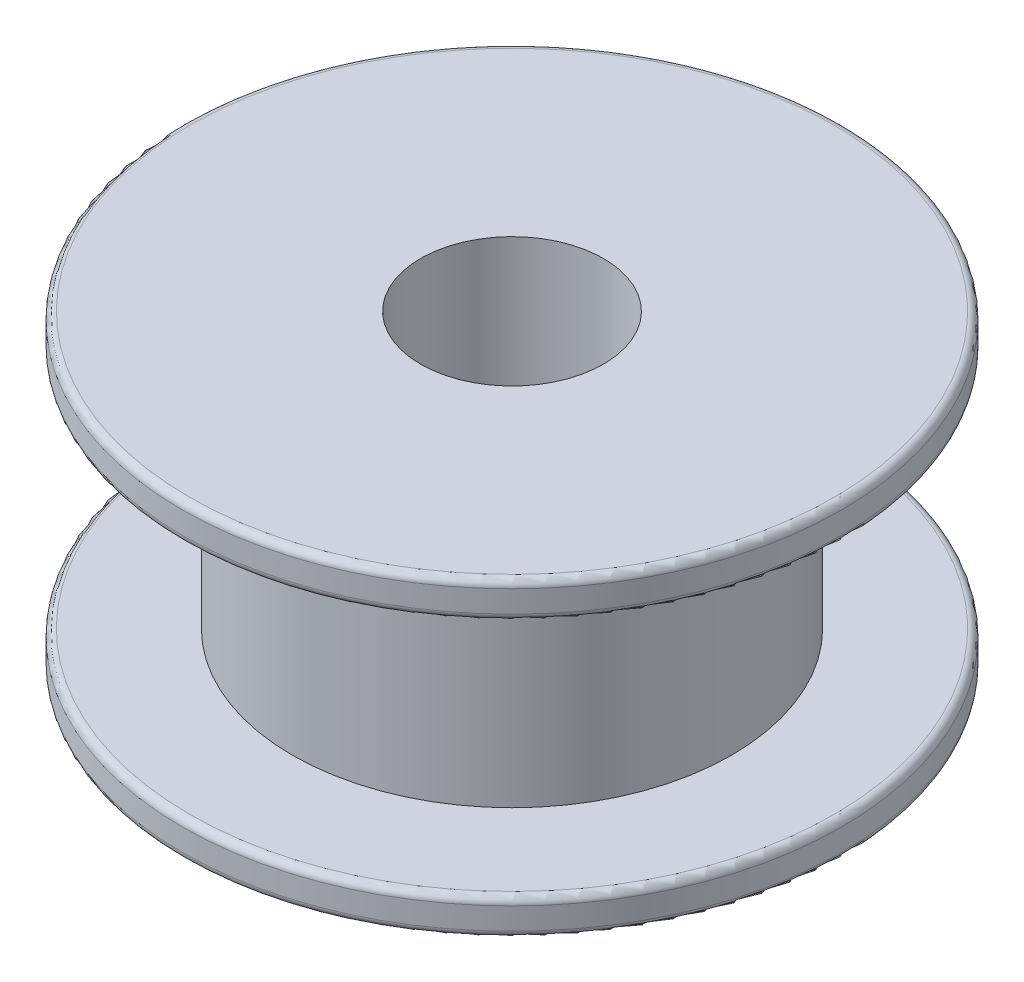
ISO-10303-21;
HEADER;
FILE_DESCRIPTION(('STEP AP214'),'2;1');
FILE_NAME('part.step','',(''),(''),'','','');
FILE_SCHEMA(('AUTOMOTIVE_DESIGN { 1 0 10303 214 1 1 1 1 }'));
ENDSEC;
DATA;
#1=APPLICATION_CONTEXT('core data for automotive mechanical design processes');
#2=APPLICATION_PROTOCOL_DEFINITION('international standard','automotive_design',2000,#1);
#3=PRODUCT_CONTEXT('',#1,'mechanical');
#4=PRODUCT('Part','Part','',(#3));
#5=PRODUCT_RELATED_PRODUCT_CATEGORY('part','',(#4));
#6=PRODUCT_DEFINITION_FORMATION('','',#4);
#7=PRODUCT_DEFINITION_CONTEXT('part definition',#1,'design');
#8=PRODUCT_DEFINITION('design','',#6,#7);
#9=PRODUCT_DEFINITION_SHAPE('','',#8);
#10=(LENGTH_UNIT() NAMED_UNIT(*) SI_UNIT(.MILLI.,.METRE.));
#11=(NAMED_UNIT(*) PLANE_ANGLE_UNIT() SI_UNIT($,.RADIAN.));
#12=(NAMED_UNIT(*) SI_UNIT($,.STERADIAN.) SOLID_ANGLE_UNIT());
#13=UNCERTAINTY_MEASURE_WITH_UNIT(LENGTH_MEASURE(1.E-05),#10,'distance_accuracy_value','');
#14=(GEOMETRIC_REPRESENTATION_CONTEXT(3) GLOBAL_UNCERTAINTY_ASSIGNED_CONTEXT((#13)) GLOBAL_UNIT_ASSIGNED_CONTEXT((#10,
#11,#12)) REPRESENTATION_CONTEXT('',''));
#15=CARTESIAN_POINT('',(0.,0.,0.));
#16=DIRECTION('',(0.,0.,1.));
#17=DIRECTION('',(1.,0.,0.));
#18=AXIS2_PLACEMENT_3D('',#15,#16,#17);
#19=CARTESIAN_POINT('',(0.,1.,0.));
#20=DIRECTION('',(0.,-1.,0.));
#21=DIRECTION('',(0.,0.,-1.));
#22=AXIS2_PLACEMENT_3D('',#19,#20,#21);
#23=CYLINDRICAL_SURFACE('',#22,9.);
#24=CARTESIAN_POINT('',(0.,0.8,0.));
#25=DIRECTION('',(0.,1.,0.));
#26=DIRECTION('',(0.,0.,1.));
#27=AXIS2_PLACEMENT_3D('',#24,#25,#26);
#28=CIRCLE('',#27,9.);
#29=CARTESIAN_POINT('',(0.,0.8,9.));
#30=VERTEX_POINT('',#29);
#31=EDGE_CURVE('E53',#30,#30,#28,.F.);
#32=ORIENTED_EDGE('',*,*,#31,.T.);
#33=EDGE_LOOP('',(#32));
#34=FACE_BOUND('',#33,.T.);
#35=CARTESIAN_POINT('',(0.,0.2,0.));
#36=DIRECTION('',(0.,1.,0.));
#37=DIRECTION('',(0.,0.,1.));
#38=AXIS2_PLACEMENT_3D('',#35,#36,#37);
#39=CIRCLE('',#38,9.);
#40=CARTESIAN_POINT('',(0.,0.2,9.));
#41=VERTEX_POINT('',#40);
#42=EDGE_CURVE('E56',#41,#41,#39,.T.);
#43=ORIENTED_EDGE('',*,*,#42,.T.);
#44=EDGE_LOOP('',(#43));
#45=FACE_BOUND('',#44,.T.);
#46=ADVANCED_FACE('F30',(#34,#45),#23,.T.);
#47=CARTESIAN_POINT('',(0.,1.,0.));
#48=DIRECTION('',(0.,1.,0.));
#49=DIRECTION('',(0.,0.,1.));
#50=AXIS2_PLACEMENT_3D('',#47,#48,#49);
#51=PLANE('',#50);
#52=CARTESIAN_POINT('',(0.,1.,0.));
#53=DIRECTION('',(0.,1.,0.));
#54=DIRECTION('',(0.,0.,1.));
#55=AXIS2_PLACEMENT_3D('',#52,#53,#54);
#56=CIRCLE('',#55,8.8);
#57=CARTESIAN_POINT('',(0.,1.,8.8));
#58=VERTEX_POINT('',#57);
#59=EDGE_CURVE('E59',#58,#58,#56,.T.);
#60=ORIENTED_EDGE('',*,*,#59,.T.);
#61=EDGE_LOOP('',(#60));
#62=FACE_BOUND('',#61,.T.);
#63=CARTESIAN_POINT('',(0.,1.,0.));
#64=DIRECTION('',(0.,1.,0.));
#65=DIRECTION('',(0.,0.,1.));
#66=AXIS2_PLACEMENT_3D('',#63,#64,#65);
#67=CIRCLE('',#66,6.);
#68=CARTESIAN_POINT('',(0.,1.,-6.));
#69=VERTEX_POINT('',#68);
#70=EDGE_CURVE('E62',#69,#69,#67,.T.);
#71=ORIENTED_EDGE('',*,*,#70,.F.);
#72=EDGE_LOOP('',(#71));
#73=FACE_BOUND('',#72,.T.);
#74=ADVANCED_FACE('F98',(#62,#73),#51,.T.);
#75=CARTESIAN_POINT('',(0.,0.,0.));
#76=DIRECTION('',(0.,1.,0.));
#77=DIRECTION('',(0.,0.,1.));
#78=AXIS2_PLACEMENT_3D('',#75,#76,#77);
#79=PLANE('',#78);
#80=CARTESIAN_POINT('',(0.,0.,0.));
#81=DIRECTION('',(0.,1.,0.));
#82=DIRECTION('',(0.,0.,1.));
#83=AXIS2_PLACEMENT_3D('',#80,#81,#82);
#84=CIRCLE('',#83,8.8);
#85=CARTESIAN_POINT('',(0.,0.,8.8));
#86=VERTEX_POINT('',#85);
#87=EDGE_CURVE('E50',#86,#86,#84,.F.);
#88=ORIENTED_EDGE('',*,*,#87,.T.);
#89=EDGE_LOOP('',(#88));
#90=FACE_BOUND('',#89,.T.);
#91=CARTESIAN_POINT('',(0.,0.,0.));
#92=DIRECTION('',(0.,1.,0.));
#93=DIRECTION('',(0.,0.,1.));
#94=AXIS2_PLACEMENT_3D('',#91,#92,#93);
#95=CIRCLE('',#94,2.5);
#96=CARTESIAN_POINT('',(0.,0.,2.5));
#97=VERTEX_POINT('',#96);
#98=EDGE_CURVE('E68',#97,#97,#95,.T.);
#99=ORIENTED_EDGE('',*,*,#98,.T.);
#100=EDGE_LOOP('',(#99));
#101=FACE_BOUND('',#100,.T.);
#102=ADVANCED_FACE('F75',(#90,#101),#79,.F.);
#103=CARTESIAN_POINT('',(0.,7.5,0.));
#104=DIRECTION('',(0.,-1.,0.));
#105=DIRECTION('',(0.,0.,-1.));
#106=AXIS2_PLACEMENT_3D('',#103,#104,#105);
#107=CYLINDRICAL_SURFACE('',#106,6.);
#108=CARTESIAN_POINT('',(0.,7.5,0.));
#109=DIRECTION('',(0.,1.,0.));
#110=DIRECTION('',(0.,0.,1.));
#111=AXIS2_PLACEMENT_3D('',#108,#109,#110);
#112=CIRCLE('',#111,6.);
#113=CARTESIAN_POINT('',(0.,7.5,-6.));
#114=VERTEX_POINT('',#113);
#115=EDGE_CURVE('E65',#114,#114,#112,.T.);
#116=CARTESIAN_POINT('',(0.,7.5,-6.));
#117=CARTESIAN_POINT('',(0.,7.43229166666667,-6.));
#118=CARTESIAN_POINT('',(0.,7.36458333333333,-6.));
#119=CARTESIAN_POINT('',(0.,7.22916666666667,-6.));
#120=CARTESIAN_POINT('',(0.,7.16145833333333,-6.));
#121=CARTESIAN_POINT('',(0.,7.02604166666667,-6.));
#122=CARTESIAN_POINT('',(0.,6.95833333333333,-6.));
#123=CARTESIAN_POINT('',(0.,6.82291666666667,-6.));
#124=CARTESIAN_POINT('',(0.,6.75520833333333,-6.));
#125=CARTESIAN_POINT('',(0.,6.61979166666667,-6.));
#126=CARTESIAN_POINT('',(0.,6.55208333333333,-6.));
#127=CARTESIAN_POINT('',(0.,6.41666666666667,-6.));
#128=CARTESIAN_POINT('',(0.,6.34895833333333,-6.));
#129=CARTESIAN_POINT('',(0.,6.21354166666667,-6.));
#130=CARTESIAN_POINT('',(0.,6.14583333333333,-6.));
#131=CARTESIAN_POINT('',(0.,6.01041666666667,-6.));
#132=CARTESIAN_POINT('',(0.,5.94270833333333,-6.));
#133=CARTESIAN_POINT('',(0.,5.80729166666667,-6.));
#134=CARTESIAN_POINT('',(0.,5.73958333333333,-6.));
#135=CARTESIAN_POINT('',(0.,5.60416666666667,-6.));
#136=CARTESIAN_POINT('',(0.,5.53645833333333,-6.));
#137=CARTESIAN_POINT('',(0.,5.40104166666667,-6.));
#138=CARTESIAN_POINT('',(0.,5.33333333333333,-6.));
#139=CARTESIAN_POINT('',(0.,5.19791666666667,-6.));
#140=CARTESIAN_POINT('',(0.,5.13020833333333,-6.));
#141=CARTESIAN_POINT('',(0.,4.99479166666667,-6.));
#142=CARTESIAN_POINT('',(0.,4.92708333333333,-6.));
#143=CARTESIAN_POINT('',(0.,4.79166666666667,-6.));
#144=CARTESIAN_POINT('',(0.,4.72395833333333,-6.));
#145=CARTESIAN_POINT('',(0.,4.58854166666667,-6.));
#146=CARTESIAN_POINT('',(0.,4.52083333333333,-6.));
#147=CARTESIAN_POINT('',(0.,4.38541666666667,-6.));
#148=CARTESIAN_POINT('',(0.,4.31770833333333,-6.));
#149=CARTESIAN_POINT('',(0.,4.18229166666667,-6.));
#150=CARTESIAN_POINT('',(0.,4.11458333333333,-6.));
#151=CARTESIAN_POINT('',(0.,3.97916666666667,-6.));
#152=CARTESIAN_POINT('',(0.,3.91145833333333,-6.));
#153=CARTESIAN_POINT('',(0.,3.77604166666667,-6.));
#154=CARTESIAN_POINT('',(0.,3.70833333333333,-6.));
#155=CARTESIAN_POINT('',(0.,3.57291666666667,-6.));
#156=CARTESIAN_POINT('',(0.,3.50520833333333,-6.));
#157=CARTESIAN_POINT('',(0.,3.36979166666667,-6.));
#158=CARTESIAN_POINT('',(0.,3.30208333333333,-6.));
#159=CARTESIAN_POINT('',(0.,3.16666666666667,-6.));
#160=CARTESIAN_POINT('',(0.,3.09895833333333,-6.));
#161=CARTESIAN_POINT('',(0.,2.96354166666667,-6.));
#162=CARTESIAN_POINT('',(0.,2.89583333333333,-6.));
#163=CARTESIAN_POINT('',(0.,2.76041666666667,-6.));
#164=CARTESIAN_POINT('',(0.,2.69270833333333,-6.));
#165=CARTESIAN_POINT('',(0.,2.55729166666667,-6.));
#166=CARTESIAN_POINT('',(0.,2.48958333333333,-6.));
#167=CARTESIAN_POINT('',(0.,2.35416666666667,-6.));
#168=CARTESIAN_POINT('',(0.,2.28645833333333,-6.));
#169=CARTESIAN_POINT('',(0.,2.15104166666667,-6.));
#170=CARTESIAN_POINT('',(0.,2.08333333333333,-6.));
#171=CARTESIAN_POINT('',(0.,1.94791666666667,-6.));
#172=CARTESIAN_POINT('',(0.,1.88020833333333,-6.));
#173=CARTESIAN_POINT('',(0.,1.74479166666667,-6.));
#174=CARTESIAN_POINT('',(0.,1.67708333333333,-6.));
#175=CARTESIAN_POINT('',(0.,1.54166666666667,-6.));
#176=CARTESIAN_POINT('',(0.,1.47395833333333,-6.));
#177=CARTESIAN_POINT('',(0.,1.33854166666667,-6.));
#178=CARTESIAN_POINT('',(0.,1.27083333333333,-6.));
#179=CARTESIAN_POINT('',(0.,1.13541666666667,-6.));
#180=CARTESIAN_POINT('',(0.,1.06770833333333,-6.));
#181=CARTESIAN_POINT('',(0.,1.,-6.));
#182=B_SPLINE_CURVE_WITH_KNOTS('',3,(#116,#117,#118,#119,#120,#121,#122,#123,#124,#125,#126,
#127,#128,#129,#130,#131,#132,#133,#134,#135,#136,#137,#138,#139,#140,#141,#142,#143,#144,#145,
#146,#147,#148,#149,#150,#151,#152,#153,#154,#155,#156,#157,#158,#159,#160,#161,#162,#163,#164,
#165,#166,#167,#168,#169,#170,#171,#172,#173,#174,#175,#176,#177,#178,#179,#180,#181),
.UNSPECIFIED.,.F.,.F.,(4,2,2,2,2,2,2,2,2,2,2,2,2,2,2,2,2,2,2,2,2,2,2,2,2,2,2,2,2,2,2,2,4),(0.,
0.203125,0.40625,0.609375000000001,0.812500000000001,1.015625,1.21875,1.421875,1.625,1.828125,
2.03125,2.234375,2.4375,2.640625,2.84375,3.046875,3.25,3.453125,3.65625,3.859375,4.0625,
4.265625,4.46875,4.671875,4.875,5.078125,5.28125,5.484375,5.6875,5.890625,6.09375,6.296875,6.5),.UNSPECIFIED.);
#183=EDGE_CURVE('BSEAM94',#114,#69,#182,.T.);
#184=ORIENTED_EDGE('',*,*,#115,.F.);
#185=ORIENTED_EDGE('',*,*,#70,.T.);
#186=ORIENTED_EDGE('',*,*,#183,.T.);
#187=ORIENTED_EDGE('',*,*,#183,.F.);
#188=EDGE_LOOP('',(#184,#186,#185,#187));
#189=FACE_BOUND('',#188,.T.);
#190=ADVANCED_FACE('F94',(#189),#107,.T.);
#191=CARTESIAN_POINT('',(0.,8.5,0.));
#192=DIRECTION('',(0.,-1.,0.));
#193=DIRECTION('',(0.,0.,-1.));
#194=AXIS2_PLACEMENT_3D('',#191,#192,#193);
#195=CYLINDRICAL_SURFACE('',#194,9.);
#196=CARTESIAN_POINT('',(0.,7.7,0.));
#197=DIRECTION('',(0.,1.,0.));
#198=DIRECTION('',(0.,0.,1.));
#199=AXIS2_PLACEMENT_3D('',#196,#197,#198);
#200=CIRCLE('',#199,9.);
#201=CARTESIAN_POINT('',(0.,7.7,9.));
#202=VERTEX_POINT('',#201);
#203=EDGE_CURVE('E41',#202,#202,#200,.T.);
#204=ORIENTED_EDGE('',*,*,#203,.T.);
#205=EDGE_LOOP('',(#204));
#206=FACE_BOUND('',#205,.T.);
#207=CARTESIAN_POINT('',(0.,8.3,0.));
#208=DIRECTION('',(0.,1.,0.));
#209=DIRECTION('',(0.,0.,1.));
#210=AXIS2_PLACEMENT_3D('',#207,#208,#209);
#211=CIRCLE('',#210,9.);
#212=CARTESIAN_POINT('',(0.,8.3,9.));
#213=VERTEX_POINT('',#212);
#214=EDGE_CURVE('E45',#213,#213,#211,.F.);
#215=ORIENTED_EDGE('',*,*,#214,.T.);
#216=EDGE_LOOP('',(#215));
#217=FACE_BOUND('',#216,.T.);
#218=ADVANCED_FACE('F87',(#206,#217),#195,.T.);
#219=CARTESIAN_POINT('',(0.,8.5,0.));
#220=DIRECTION('',(0.,1.,0.));
#221=DIRECTION('',(0.,0.,1.));
#222=AXIS2_PLACEMENT_3D('',#219,#220,#221);
#223=PLANE('',#222);
#224=CARTESIAN_POINT('',(0.,8.5,0.));
#225=DIRECTION('',(0.,1.,0.));
#226=DIRECTION('',(0.,0.,1.));
#227=AXIS2_PLACEMENT_3D('',#224,#225,#226);
#228=CIRCLE('',#227,8.8);
#229=CARTESIAN_POINT('',(0.,8.5,8.8));
#230=VERTEX_POINT('',#229);
#231=EDGE_CURVE('E10',#230,#230,#228,.T.);
#232=ORIENTED_EDGE('',*,*,#231,.T.);
#233=EDGE_LOOP('',(#232));
#234=FACE_BOUND('',#233,.T.);
#235=CARTESIAN_POINT('',(0.,8.5,0.));
#236=DIRECTION('',(0.,1.,0.));
#237=DIRECTION('',(0.,0.,1.));
#238=AXIS2_PLACEMENT_3D('',#235,#236,#237);
#239=CIRCLE('',#238,2.5);
#240=CARTESIAN_POINT('',(0.,8.5,2.5));
#241=VERTEX_POINT('',#240);
#242=EDGE_CURVE('E69',#241,#241,#239,.T.);
#243=ORIENTED_EDGE('',*,*,#242,.F.);
#244=EDGE_LOOP('',(#243));
#245=FACE_BOUND('',#244,.T.);
#246=ADVANCED_FACE('F85',(#234,#245),#223,.T.);
#247=CARTESIAN_POINT('',(0.,7.5,0.));
#248=DIRECTION('',(0.,1.,0.));
#249=DIRECTION('',(0.,0.,1.));
#250=AXIS2_PLACEMENT_3D('',#247,#248,#249);
#251=PLANE('',#250);
#252=CARTESIAN_POINT('',(0.,7.5,0.));
#253=DIRECTION('',(0.,1.,0.));
#254=DIRECTION('',(0.,0.,1.));
#255=AXIS2_PLACEMENT_3D('',#252,#253,#254);
#256=CIRCLE('',#255,8.8);
#257=CARTESIAN_POINT('',(0.,7.5,8.8));
#258=VERTEX_POINT('',#257);
#259=EDGE_CURVE('E37',#258,#258,#256,.F.);
#260=ORIENTED_EDGE('',*,*,#259,.T.);
#261=EDGE_LOOP('',(#260));
#262=FACE_BOUND('',#261,.T.);
#263=ORIENTED_EDGE('',*,*,#115,.T.);
#264=EDGE_LOOP('',(#263));
#265=FACE_BOUND('',#264,.T.);
#266=ADVANCED_FACE('F81',(#262,#265),#251,.F.);
#267=CARTESIAN_POINT('',(0.,0.,0.));
#268=DIRECTION('',(0.,1.,0.));
#269=DIRECTION('',(0.,0.,1.));
#270=AXIS2_PLACEMENT_3D('',#267,#268,#269);
#271=CYLINDRICAL_SURFACE('',#270,2.5);
#272=ORIENTED_EDGE('',*,*,#98,.F.);
#273=EDGE_LOOP('',(#272));
#274=FACE_BOUND('',#273,.T.);
#275=ORIENTED_EDGE('',*,*,#242,.T.);
#276=EDGE_LOOP('',(#275));
#277=FACE_BOUND('',#276,.T.);
#278=ADVANCED_FACE('F77',(#274,#277),#271,.F.);
#279=CARTESIAN_POINT('',(0.,0.8,0.));
#280=DIRECTION('',(0.,1.,0.));
#281=DIRECTION('',(0.,0.,1.));
#282=AXIS2_PLACEMENT_3D('',#279,#280,#281);
#283=TOROIDAL_SURFACE('',#282,8.8,0.2);
#284=ORIENTED_EDGE('',*,*,#31,.F.);
#285=EDGE_LOOP('',(#284));
#286=FACE_BOUND('',#285,.T.);
#287=ORIENTED_EDGE('',*,*,#59,.F.);
#288=EDGE_LOOP('',(#287));
#289=FACE_BOUND('',#288,.T.);
#290=ADVANCED_FACE('F80',(#286,#289),#283,.T.);
#291=CARTESIAN_POINT('',(0.,0.2,0.));
#292=DIRECTION('',(0.,1.,0.));
#293=DIRECTION('',(0.,0.,1.));
#294=AXIS2_PLACEMENT_3D('',#291,#292,#293);
#295=TOROIDAL_SURFACE('',#294,8.8,0.2);
#296=ORIENTED_EDGE('',*,*,#87,.F.);
#297=EDGE_LOOP('',(#296));
#298=FACE_BOUND('',#297,.T.);
#299=ORIENTED_EDGE('',*,*,#42,.F.);
#300=EDGE_LOOP('',(#299));
#301=FACE_BOUND('',#300,.T.);
#302=ADVANCED_FACE('F111',(#298,#301),#295,.T.);
#303=CARTESIAN_POINT('',(0.,7.7,0.));
#304=DIRECTION('',(0.,1.,0.));
#305=DIRECTION('',(0.,0.,1.));
#306=AXIS2_PLACEMENT_3D('',#303,#304,#305);
#307=TOROIDAL_SURFACE('',#306,8.8,0.2);
#308=ORIENTED_EDGE('',*,*,#259,.F.);
#309=EDGE_LOOP('',(#308));
#310=FACE_BOUND('',#309,.T.);
#311=ORIENTED_EDGE('',*,*,#203,.F.);
#312=EDGE_LOOP('',(#311));
#313=FACE_BOUND('',#312,.T.);
#314=ADVANCED_FACE('F114',(#310,#313),#307,.T.);
#315=CARTESIAN_POINT('',(0.,8.3,0.));
#316=DIRECTION('',(0.,1.,0.));
#317=DIRECTION('',(0.,0.,1.));
#318=AXIS2_PLACEMENT_3D('',#315,#316,#317);
#319=TOROIDAL_SURFACE('',#318,8.8,0.2);
#320=ORIENTED_EDGE('',*,*,#214,.F.);
#321=EDGE_LOOP('',(#320));
#322=FACE_BOUND('',#321,.T.);
#323=ORIENTED_EDGE('',*,*,#231,.F.);
#324=EDGE_LOOP('',(#323));
#325=FACE_BOUND('',#324,.T.);
#326=ADVANCED_FACE('F32',(#322,#325),#319,.T.);
#327=CLOSED_SHELL('',(#46,#74,#102,#190,#218,#246,#266,#278,#290,#302,#314,#326));
#328=MANIFOLD_SOLID_BREP('B2',#327);
#329=ADVANCED_BREP_SHAPE_REPRESENTATION('',(#18,#328),#14);
#330=SHAPE_DEFINITION_REPRESENTATION(#9,#329);
ENDSEC;
END-ISO-10303-21;
